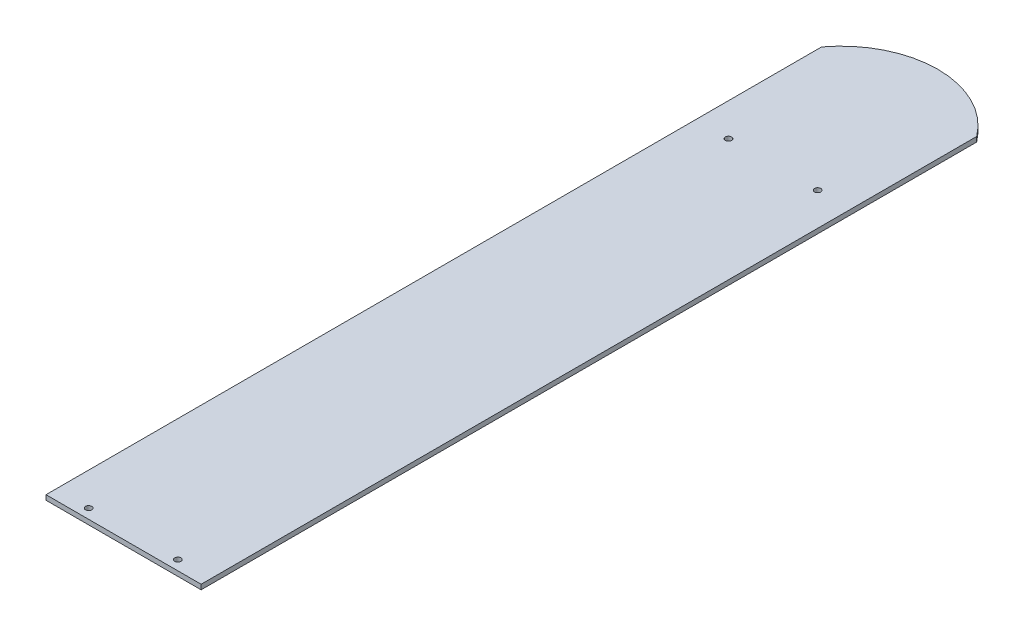
ISO-10303-21;
HEADER;
FILE_DESCRIPTION(('STEP AP214'),'2;1');
FILE_NAME('part.step','',(''),(''),'','','');
FILE_SCHEMA(('AUTOMOTIVE_DESIGN { 1 0 10303 214 1 1 1 1 }'));
ENDSEC;
DATA;
#1=APPLICATION_CONTEXT('core data for automotive mechanical design processes');
#2=APPLICATION_PROTOCOL_DEFINITION('international standard','automotive_design',2000,#1);
#3=PRODUCT_CONTEXT('',#1,'mechanical');
#4=PRODUCT('Part','Part','',(#3));
#5=PRODUCT_RELATED_PRODUCT_CATEGORY('part','',(#4));
#6=PRODUCT_DEFINITION_FORMATION('','',#4);
#7=PRODUCT_DEFINITION_CONTEXT('part definition',#1,'design');
#8=PRODUCT_DEFINITION('design','',#6,#7);
#9=PRODUCT_DEFINITION_SHAPE('','',#8);
#10=(LENGTH_UNIT() NAMED_UNIT(*) SI_UNIT(.MILLI.,.METRE.));
#11=(NAMED_UNIT(*) PLANE_ANGLE_UNIT() SI_UNIT($,.RADIAN.));
#12=(NAMED_UNIT(*) SI_UNIT($,.STERADIAN.) SOLID_ANGLE_UNIT());
#13=UNCERTAINTY_MEASURE_WITH_UNIT(LENGTH_MEASURE(1.E-05),#10,'distance_accuracy_value','');
#14=(GEOMETRIC_REPRESENTATION_CONTEXT(3) GLOBAL_UNCERTAINTY_ASSIGNED_CONTEXT((#13)) GLOBAL_UNIT_ASSIGNED_CONTEXT((#10,
#11,#12)) REPRESENTATION_CONTEXT('',''));
#15=CARTESIAN_POINT('',(0.,0.,0.));
#16=DIRECTION('',(0.,0.,1.));
#17=DIRECTION('',(1.,0.,0.));
#18=AXIS2_PLACEMENT_3D('',#15,#16,#17);
#19=CARTESIAN_POINT('',(50.8,3.175,38.1));
#20=DIRECTION('',(0.,-1.,0.));
#21=DIRECTION('',(0.,0.,-1.));
#22=AXIS2_PLACEMENT_3D('',#19,#20,#21);
#23=CYLINDRICAL_SURFACE('',#22,63.5);
#24=CARTESIAN_POINT('',(50.8,0.,38.1));
#25=DIRECTION('',(0.,1.,0.));
#26=DIRECTION('',(0.,0.,-1.));
#27=AXIS2_PLACEMENT_3D('',#24,#25,#26);
#28=CIRCLE('',#27,63.5);
#29=CARTESIAN_POINT('',(101.6,0.,0.));
#30=VERTEX_POINT('',#29);
#31=CARTESIAN_POINT('',(0.,0.,0.));
#32=VERTEX_POINT('',#31);
#33=EDGE_CURVE('E103',#30,#32,#28,.T.);
#34=ORIENTED_EDGE('',*,*,#33,.T.);
#35=DIRECTION('',(0.,-1.,0.));
#36=VECTOR('',#35,1.);
#37=CARTESIAN_POINT('',(0.,3.175,0.));
#38=LINE('',#37,#36);
#39=CARTESIAN_POINT('',(0.,3.175,0.));
#40=VERTEX_POINT('',#39);
#41=EDGE_CURVE('E11',#40,#32,#38,.T.);
#42=ORIENTED_EDGE('',*,*,#41,.F.);
#43=CARTESIAN_POINT('',(50.8,3.175,38.1));
#44=DIRECTION('',(0.,1.,0.));
#45=DIRECTION('',(0.,0.,-1.));
#46=AXIS2_PLACEMENT_3D('',#43,#44,#45);
#47=CIRCLE('',#46,63.5);
#48=CARTESIAN_POINT('',(101.6,3.175,0.));
#49=VERTEX_POINT('',#48);
#50=EDGE_CURVE('E91',#49,#40,#47,.T.);
#51=ORIENTED_EDGE('',*,*,#50,.F.);
#52=DIRECTION('',(0.,-1.,0.));
#53=VECTOR('',#52,1.);
#54=CARTESIAN_POINT('',(101.6,3.175,0.));
#55=LINE('',#54,#53);
#56=EDGE_CURVE('E99',#49,#30,#55,.T.);
#57=ORIENTED_EDGE('',*,*,#56,.T.);
#58=EDGE_LOOP('',(#34,#42,#51,#57));
#59=FACE_BOUND('',#58,.T.);
#60=ADVANCED_FACE('F40',(#59),#23,.T.);
#61=CARTESIAN_POINT('',(0.,3.175,0.));
#62=DIRECTION('',(1.,0.,0.));
#63=DIRECTION('',(0.,0.,-1.));
#64=AXIS2_PLACEMENT_3D('',#61,#62,#63);
#65=PLANE('',#64);
#66=DIRECTION('',(0.,0.,1.));
#67=VECTOR('',#66,1.);
#68=CARTESIAN_POINT('',(0.,0.,0.));
#69=LINE('',#68,#67);
#70=CARTESIAN_POINT('',(0.,0.,508.));
#71=VERTEX_POINT('',#70);
#72=EDGE_CURVE('E95',#32,#71,#69,.T.);
#73=ORIENTED_EDGE('',*,*,#72,.T.);
#74=DIRECTION('',(0.,-1.,0.));
#75=VECTOR('',#74,1.);
#76=CARTESIAN_POINT('',(0.,3.175,508.));
#77=LINE('',#76,#75);
#78=CARTESIAN_POINT('',(0.,3.175,508.));
#79=VERTEX_POINT('',#78);
#80=EDGE_CURVE('E48',#79,#71,#77,.T.);
#81=ORIENTED_EDGE('',*,*,#80,.F.);
#82=DIRECTION('',(0.,0.,1.));
#83=VECTOR('',#82,1.);
#84=CARTESIAN_POINT('',(0.,3.175,0.));
#85=LINE('',#84,#83);
#86=EDGE_CURVE('E86',#40,#79,#85,.T.);
#87=ORIENTED_EDGE('',*,*,#86,.F.);
#88=ORIENTED_EDGE('',*,*,#41,.T.);
#89=EDGE_LOOP('',(#73,#81,#87,#88));
#90=FACE_BOUND('',#89,.T.);
#91=ADVANCED_FACE('F94',(#90),#65,.F.);
#92=CARTESIAN_POINT('',(0.,3.175,508.));
#93=DIRECTION('',(0.,0.,-1.));
#94=DIRECTION('',(-1.,0.,0.));
#95=AXIS2_PLACEMENT_3D('',#92,#93,#94);
#96=PLANE('',#95);
#97=DIRECTION('',(1.,0.,0.));
#98=VECTOR('',#97,1.);
#99=CARTESIAN_POINT('',(0.,0.,508.));
#100=LINE('',#99,#98);
#101=CARTESIAN_POINT('',(101.6,0.,508.));
#102=VERTEX_POINT('',#101);
#103=EDGE_CURVE('E73',#71,#102,#100,.T.);
#104=ORIENTED_EDGE('',*,*,#103,.T.);
#105=DIRECTION('',(0.,-1.,0.));
#106=VECTOR('',#105,1.);
#107=CARTESIAN_POINT('',(101.6,3.175,508.));
#108=LINE('',#107,#106);
#109=CARTESIAN_POINT('',(101.6,3.175,508.));
#110=VERTEX_POINT('',#109);
#111=EDGE_CURVE('E96',#110,#102,#108,.T.);
#112=ORIENTED_EDGE('',*,*,#111,.F.);
#113=DIRECTION('',(1.,0.,0.));
#114=VECTOR('',#113,1.);
#115=CARTESIAN_POINT('',(0.,3.175,508.));
#116=LINE('',#115,#114);
#117=EDGE_CURVE('E89',#79,#110,#116,.T.);
#118=ORIENTED_EDGE('',*,*,#117,.F.);
#119=ORIENTED_EDGE('',*,*,#80,.T.);
#120=EDGE_LOOP('',(#104,#112,#118,#119));
#121=FACE_BOUND('',#120,.T.);
#122=ADVANCED_FACE('F97',(#121),#96,.F.);
#123=CARTESIAN_POINT('',(101.6,3.175,0.));
#124=DIRECTION('',(-1.,0.,0.));
#125=DIRECTION('',(0.,0.,1.));
#126=AXIS2_PLACEMENT_3D('',#123,#124,#125);
#127=PLANE('',#126);
#128=DIRECTION('',(0.,0.,-1.));
#129=VECTOR('',#128,1.);
#130=CARTESIAN_POINT('',(101.6,0.,0.));
#131=LINE('',#130,#129);
#132=EDGE_CURVE('E79',#102,#30,#131,.T.);
#133=ORIENTED_EDGE('',*,*,#132,.T.);
#134=ORIENTED_EDGE('',*,*,#56,.F.);
#135=DIRECTION('',(0.,0.,-1.));
#136=VECTOR('',#135,1.);
#137=CARTESIAN_POINT('',(101.6,3.175,0.));
#138=LINE('',#137,#136);
#139=EDGE_CURVE('E56',#110,#49,#138,.T.);
#140=ORIENTED_EDGE('',*,*,#139,.F.);
#141=ORIENTED_EDGE('',*,*,#111,.T.);
#142=EDGE_LOOP('',(#133,#134,#140,#141));
#143=FACE_BOUND('',#142,.T.);
#144=ADVANCED_FACE('F111',(#143),#127,.F.);
#145=CARTESIAN_POINT('',(50.8,3.175,38.1));
#146=DIRECTION('',(0.,-1.,0.));
#147=DIRECTION('',(0.,0.,-1.));
#148=AXIS2_PLACEMENT_3D('',#145,#146,#147);
#149=PLANE('',#148);
#150=CARTESIAN_POINT('',(80.01,3.175,501.65));
#151=DIRECTION('',(0.,-1.,0.));
#152=DIRECTION('',(0.,0.,-1.));
#153=AXIS2_PLACEMENT_3D('',#150,#151,#152);
#154=CIRCLE('',#153,2.03199999999997);
#155=CARTESIAN_POINT('',(80.01,3.175,499.618));
#156=VERTEX_POINT('',#155);
#157=EDGE_CURVE('E120',#156,#156,#154,.T.);
#158=ORIENTED_EDGE('',*,*,#157,.T.);
#159=EDGE_LOOP('',(#158));
#160=FACE_BOUND('',#159,.T.);
#161=CARTESIAN_POINT('',(21.59,3.175,82.55));
#162=DIRECTION('',(0.,-1.,0.));
#163=DIRECTION('',(0.,0.,-1.));
#164=AXIS2_PLACEMENT_3D('',#161,#162,#163);
#165=CIRCLE('',#164,2.03200000000001);
#166=CARTESIAN_POINT('',(21.59,3.175,80.518));
#167=VERTEX_POINT('',#166);
#168=EDGE_CURVE('E126',#167,#167,#165,.T.);
#169=ORIENTED_EDGE('',*,*,#168,.T.);
#170=EDGE_LOOP('',(#169));
#171=FACE_BOUND('',#170,.T.);
#172=CARTESIAN_POINT('',(80.01,3.175,82.55));
#173=DIRECTION('',(0.,-1.,0.));
#174=DIRECTION('',(0.,0.,-1.));
#175=AXIS2_PLACEMENT_3D('',#172,#173,#174);
#176=CIRCLE('',#175,2.03200000000001);
#177=CARTESIAN_POINT('',(80.01,3.175,80.518));
#178=VERTEX_POINT('',#177);
#179=EDGE_CURVE('E127',#178,#178,#176,.T.);
#180=ORIENTED_EDGE('',*,*,#179,.T.);
#181=EDGE_LOOP('',(#180));
#182=FACE_BOUND('',#181,.T.);
#183=CARTESIAN_POINT('',(21.59,3.175,501.65));
#184=DIRECTION('',(0.,-1.,0.));
#185=DIRECTION('',(0.,0.,-1.));
#186=AXIS2_PLACEMENT_3D('',#183,#184,#185);
#187=CIRCLE('',#186,2.03199999999998);
#188=CARTESIAN_POINT('',(21.59,3.175,499.618));
#189=VERTEX_POINT('',#188);
#190=EDGE_CURVE('E106',#189,#189,#187,.T.);
#191=ORIENTED_EDGE('',*,*,#190,.T.);
#192=EDGE_LOOP('',(#191));
#193=FACE_BOUND('',#192,.T.);
#194=ORIENTED_EDGE('',*,*,#50,.T.);
#195=ORIENTED_EDGE('',*,*,#86,.T.);
#196=ORIENTED_EDGE('',*,*,#117,.T.);
#197=ORIENTED_EDGE('',*,*,#139,.T.);
#198=EDGE_LOOP('',(#194,#195,#196,#197));
#199=FACE_BOUND('',#198,.T.);
#200=ADVANCED_FACE('F87',(#160,#171,#182,#193,#199),#149,.F.);
#201=CARTESIAN_POINT('',(50.8,0.,38.1));
#202=DIRECTION('',(0.,-1.,0.));
#203=DIRECTION('',(0.,0.,-1.));
#204=AXIS2_PLACEMENT_3D('',#201,#202,#203);
#205=PLANE('',#204);
#206=CARTESIAN_POINT('',(80.01,0.,501.65));
#207=DIRECTION('',(0.,-1.,0.));
#208=DIRECTION('',(0.,0.,-1.));
#209=AXIS2_PLACEMENT_3D('',#206,#207,#208);
#210=CIRCLE('',#209,2.03199999999997);
#211=CARTESIAN_POINT('',(80.01,0.,499.618));
#212=VERTEX_POINT('',#211);
#213=EDGE_CURVE('E130',#212,#212,#210,.T.);
#214=ORIENTED_EDGE('',*,*,#213,.F.);
#215=EDGE_LOOP('',(#214));
#216=FACE_BOUND('',#215,.T.);
#217=CARTESIAN_POINT('',(21.59,0.,82.55));
#218=DIRECTION('',(0.,-1.,0.));
#219=DIRECTION('',(0.,0.,-1.));
#220=AXIS2_PLACEMENT_3D('',#217,#218,#219);
#221=CIRCLE('',#220,2.03200000000001);
#222=CARTESIAN_POINT('',(21.59,0.,80.518));
#223=VERTEX_POINT('',#222);
#224=EDGE_CURVE('E123',#223,#223,#221,.T.);
#225=ORIENTED_EDGE('',*,*,#224,.F.);
#226=EDGE_LOOP('',(#225));
#227=FACE_BOUND('',#226,.T.);
#228=CARTESIAN_POINT('',(80.01,0.,82.55));
#229=DIRECTION('',(0.,-1.,0.));
#230=DIRECTION('',(0.,0.,-1.));
#231=AXIS2_PLACEMENT_3D('',#228,#229,#230);
#232=CIRCLE('',#231,2.03200000000001);
#233=CARTESIAN_POINT('',(80.01,0.,80.518));
#234=VERTEX_POINT('',#233);
#235=EDGE_CURVE('E135',#234,#234,#232,.T.);
#236=ORIENTED_EDGE('',*,*,#235,.F.);
#237=EDGE_LOOP('',(#236));
#238=FACE_BOUND('',#237,.T.);
#239=CARTESIAN_POINT('',(21.59,0.,501.65));
#240=DIRECTION('',(0.,-1.,0.));
#241=DIRECTION('',(0.,0.,-1.));
#242=AXIS2_PLACEMENT_3D('',#239,#240,#241);
#243=CIRCLE('',#242,2.03199999999998);
#244=CARTESIAN_POINT('',(21.59,0.,499.618));
#245=VERTEX_POINT('',#244);
#246=EDGE_CURVE('E117',#245,#245,#243,.T.);
#247=ORIENTED_EDGE('',*,*,#246,.F.);
#248=EDGE_LOOP('',(#247));
#249=FACE_BOUND('',#248,.T.);
#250=ORIENTED_EDGE('',*,*,#33,.F.);
#251=ORIENTED_EDGE('',*,*,#132,.F.);
#252=ORIENTED_EDGE('',*,*,#103,.F.);
#253=ORIENTED_EDGE('',*,*,#72,.F.);
#254=EDGE_LOOP('',(#250,#251,#252,#253));
#255=FACE_BOUND('',#254,.T.);
#256=ADVANCED_FACE('F114',(#216,#227,#238,#249,#255),#205,.T.);
#257=CARTESIAN_POINT('',(21.59,3.175,501.65));
#258=DIRECTION('',(0.,-1.,0.));
#259=DIRECTION('',(0.,0.,-1.));
#260=AXIS2_PLACEMENT_3D('',#257,#258,#259);
#261=CYLINDRICAL_SURFACE('',#260,2.03199999999998);
#262=ORIENTED_EDGE('',*,*,#190,.F.);
#263=EDGE_LOOP('',(#262));
#264=FACE_BOUND('',#263,.T.);
#265=ORIENTED_EDGE('',*,*,#246,.T.);
#266=EDGE_LOOP('',(#265));
#267=FACE_BOUND('',#266,.T.);
#268=ADVANCED_FACE('F147',(#264,#267),#261,.F.);
#269=CARTESIAN_POINT('',(80.01,3.175,82.55));
#270=DIRECTION('',(0.,-1.,0.));
#271=DIRECTION('',(0.,0.,-1.));
#272=AXIS2_PLACEMENT_3D('',#269,#270,#271);
#273=CYLINDRICAL_SURFACE('',#272,2.03200000000001);
#274=ORIENTED_EDGE('',*,*,#179,.F.);
#275=EDGE_LOOP('',(#274));
#276=FACE_BOUND('',#275,.T.);
#277=ORIENTED_EDGE('',*,*,#235,.T.);
#278=EDGE_LOOP('',(#277));
#279=FACE_BOUND('',#278,.T.);
#280=ADVANCED_FACE('F143',(#276,#279),#273,.F.);
#281=CARTESIAN_POINT('',(21.59,3.175,82.55));
#282=DIRECTION('',(0.,-1.,0.));
#283=DIRECTION('',(0.,0.,-1.));
#284=AXIS2_PLACEMENT_3D('',#281,#282,#283);
#285=CYLINDRICAL_SURFACE('',#284,2.03200000000001);
#286=ORIENTED_EDGE('',*,*,#168,.F.);
#287=EDGE_LOOP('',(#286));
#288=FACE_BOUND('',#287,.T.);
#289=ORIENTED_EDGE('',*,*,#224,.T.);
#290=EDGE_LOOP('',(#289));
#291=FACE_BOUND('',#290,.T.);
#292=ADVANCED_FACE('F146',(#288,#291),#285,.F.);
#293=CARTESIAN_POINT('',(80.01,3.175,501.65));
#294=DIRECTION('',(0.,-1.,0.));
#295=DIRECTION('',(0.,0.,-1.));
#296=AXIS2_PLACEMENT_3D('',#293,#294,#295);
#297=CYLINDRICAL_SURFACE('',#296,2.03199999999997);
#298=ORIENTED_EDGE('',*,*,#157,.F.);
#299=EDGE_LOOP('',(#298));
#300=FACE_BOUND('',#299,.T.);
#301=ORIENTED_EDGE('',*,*,#213,.T.);
#302=EDGE_LOOP('',(#301));
#303=FACE_BOUND('',#302,.T.);
#304=ADVANCED_FACE('F185',(#300,#303),#297,.F.);
#305=CLOSED_SHELL('',(#60,#91,#122,#144,#200,#256,#268,#280,#292,#304));
#306=MANIFOLD_SOLID_BREP('B2',#305);
#307=ADVANCED_BREP_SHAPE_REPRESENTATION('',(#18,#306),#14);
#308=SHAPE_DEFINITION_REPRESENTATION(#9,#307);
ENDSEC;
END-ISO-10303-21;
